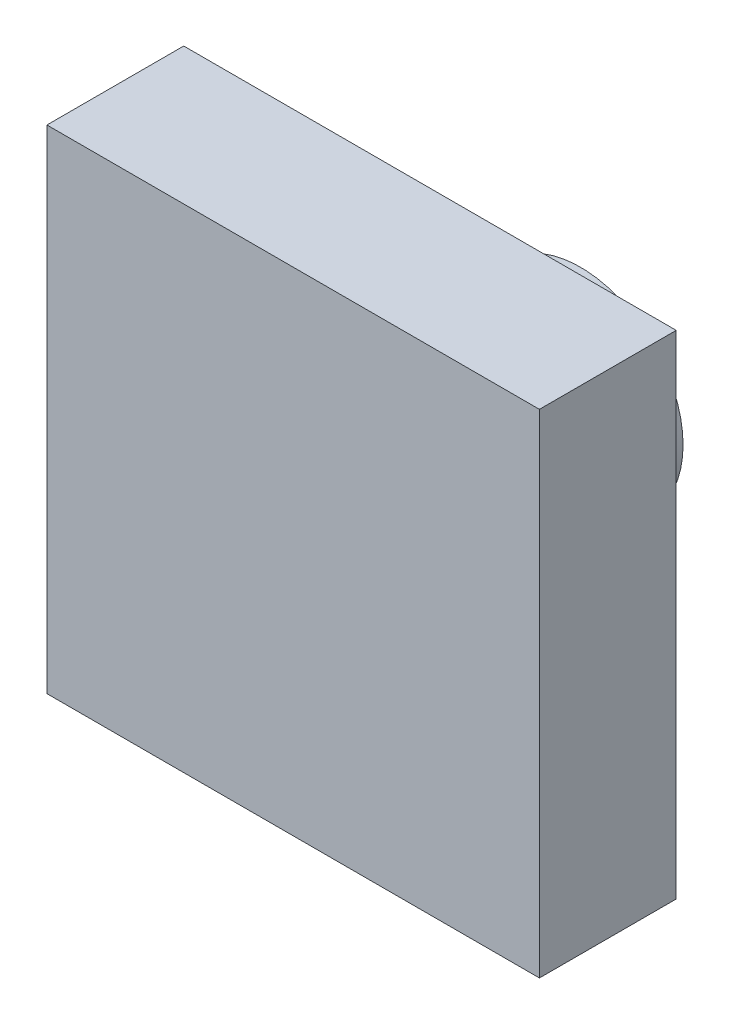
ISO-10303-21;
HEADER;
FILE_DESCRIPTION(('STEP AP214'),'2;1');
FILE_NAME('part.step','',(''),(''),'','','');
FILE_SCHEMA(('AUTOMOTIVE_DESIGN { 1 0 10303 214 1 1 1 1 }'));
ENDSEC;
DATA;
#1=APPLICATION_CONTEXT('core data for automotive mechanical design processes');
#2=APPLICATION_PROTOCOL_DEFINITION('international standard','automotive_design',2000,#1);
#3=PRODUCT_CONTEXT('',#1,'mechanical');
#4=PRODUCT('Part','Part','',(#3));
#5=PRODUCT_RELATED_PRODUCT_CATEGORY('part','',(#4));
#6=PRODUCT_DEFINITION_FORMATION('','',#4);
#7=PRODUCT_DEFINITION_CONTEXT('part definition',#1,'design');
#8=PRODUCT_DEFINITION('design','',#6,#7);
#9=PRODUCT_DEFINITION_SHAPE('','',#8);
#10=(LENGTH_UNIT() NAMED_UNIT(*) SI_UNIT(.MILLI.,.METRE.));
#11=(NAMED_UNIT(*) PLANE_ANGLE_UNIT() SI_UNIT($,.RADIAN.));
#12=(NAMED_UNIT(*) SI_UNIT($,.STERADIAN.) SOLID_ANGLE_UNIT());
#13=UNCERTAINTY_MEASURE_WITH_UNIT(LENGTH_MEASURE(1.E-05),#10,'distance_accuracy_value','');
#14=(GEOMETRIC_REPRESENTATION_CONTEXT(3) GLOBAL_UNCERTAINTY_ASSIGNED_CONTEXT((#13)) GLOBAL_UNIT_ASSIGNED_CONTEXT((#10,
#11,#12)) REPRESENTATION_CONTEXT('',''));
#15=CARTESIAN_POINT('',(0.,0.,0.));
#16=DIRECTION('',(0.,0.,1.));
#17=DIRECTION('',(1.,0.,0.));
#18=AXIS2_PLACEMENT_3D('',#15,#16,#17);
#19=CARTESIAN_POINT('',(0.,0.,0.));
#20=DIRECTION('',(0.,0.,1.));
#21=DIRECTION('',(1.,0.,0.));
#22=AXIS2_PLACEMENT_3D('',#19,#20,#21);
#23=PLANE('',#22);
#24=DIRECTION('',(0.,1.,0.));
#25=VECTOR('',#24,1.);
#26=CARTESIAN_POINT('',(-18.,0.,0.));
#27=LINE('',#26,#25);
#28=CARTESIAN_POINT('',(-18.,-18.,0.));
#29=VERTEX_POINT('',#28);
#30=CARTESIAN_POINT('',(-18.,18.,0.));
#31=VERTEX_POINT('',#30);
#32=EDGE_CURVE('E152',#29,#31,#27,.T.);
#33=ORIENTED_EDGE('',*,*,#32,.T.);
#34=DIRECTION('',(-1.,0.,0.));
#35=VECTOR('',#34,1.);
#36=CARTESIAN_POINT('',(0.,18.,0.));
#37=LINE('',#36,#35);
#38=CARTESIAN_POINT('',(18.,18.,0.));
#39=VERTEX_POINT('',#38);
#40=EDGE_CURVE('E159',#39,#31,#37,.T.);
#41=ORIENTED_EDGE('',*,*,#40,.F.);
#42=DIRECTION('',(0.,1.,0.));
#43=VECTOR('',#42,1.);
#44=CARTESIAN_POINT('',(18.,0.,0.));
#45=LINE('',#44,#43);
#46=CARTESIAN_POINT('',(18.,-18.,0.));
#47=VERTEX_POINT('',#46);
#48=EDGE_CURVE('E170',#47,#39,#45,.T.);
#49=ORIENTED_EDGE('',*,*,#48,.F.);
#50=DIRECTION('',(-1.,0.,0.));
#51=VECTOR('',#50,1.);
#52=CARTESIAN_POINT('',(0.,-18.,0.));
#53=LINE('',#52,#51);
#54=EDGE_CURVE('E167',#47,#29,#53,.T.);
#55=ORIENTED_EDGE('',*,*,#54,.T.);
#56=EDGE_LOOP('',(#33,#41,#49,#55));
#57=FACE_BOUND('',#56,.T.);
#58=DIRECTION('',(0.,1.,0.));
#59=VECTOR('',#58,1.);
#60=CARTESIAN_POINT('',(-10.8100558659218,0.,0.));
#61=LINE('',#60,#59);
#62=CARTESIAN_POINT('',(-10.8100558659218,-10.8100558659218,0.));
#63=VERTEX_POINT('',#62);
#64=CARTESIAN_POINT('',(-10.8100558659218,10.8100558659218,0.));
#65=VERTEX_POINT('',#64);
#66=EDGE_CURVE('E59',#63,#65,#61,.T.);
#67=ORIENTED_EDGE('',*,*,#66,.F.);
#68=DIRECTION('',(-1.,0.,0.));
#69=VECTOR('',#68,1.);
#70=CARTESIAN_POINT('',(0.,-10.8100558659218,0.));
#71=LINE('',#70,#69);
#72=CARTESIAN_POINT('',(10.8100558659218,-10.8100558659218,0.));
#73=VERTEX_POINT('',#72);
#74=EDGE_CURVE('E130',#73,#63,#71,.T.);
#75=ORIENTED_EDGE('',*,*,#74,.F.);
#76=DIRECTION('',(0.,1.,0.));
#77=VECTOR('',#76,1.);
#78=CARTESIAN_POINT('',(10.8100558659218,0.,0.));
#79=LINE('',#78,#77);
#80=CARTESIAN_POINT('',(10.8100558659218,10.8100558659218,0.));
#81=VERTEX_POINT('',#80);
#82=EDGE_CURVE('E140',#73,#81,#79,.T.);
#83=ORIENTED_EDGE('',*,*,#82,.T.);
#84=DIRECTION('',(-1.,0.,0.));
#85=VECTOR('',#84,1.);
#86=CARTESIAN_POINT('',(0.,10.8100558659218,0.));
#87=LINE('',#86,#85);
#88=EDGE_CURVE('E137',#81,#65,#87,.T.);
#89=ORIENTED_EDGE('',*,*,#88,.T.);
#90=EDGE_LOOP('',(#67,#75,#83,#89));
#91=FACE_BOUND('',#90,.T.);
#92=ADVANCED_FACE('F43',(#57,#91),#23,.F.);
#93=CARTESIAN_POINT('',(-18.,0.,10.));
#94=DIRECTION('',(-1.,0.,0.));
#95=DIRECTION('',(0.,0.,1.));
#96=AXIS2_PLACEMENT_3D('',#93,#94,#95);
#97=PLANE('',#96);
#98=ORIENTED_EDGE('',*,*,#32,.F.);
#99=DIRECTION('',(0.,0.,-1.));
#100=VECTOR('',#99,1.);
#101=CARTESIAN_POINT('',(-18.,-18.,10.));
#102=LINE('',#101,#100);
#103=CARTESIAN_POINT('',(-18.,-18.,10.));
#104=VERTEX_POINT('',#103);
#105=EDGE_CURVE('E47',#104,#29,#102,.T.);
#106=ORIENTED_EDGE('',*,*,#105,.F.);
#107=DIRECTION('',(0.,1.,0.));
#108=VECTOR('',#107,1.);
#109=CARTESIAN_POINT('',(-18.,0.,10.));
#110=LINE('',#109,#108);
#111=CARTESIAN_POINT('',(-18.,18.,10.));
#112=VERTEX_POINT('',#111);
#113=EDGE_CURVE('E156',#104,#112,#110,.T.);
#114=ORIENTED_EDGE('',*,*,#113,.T.);
#115=DIRECTION('',(0.,0.,-1.));
#116=VECTOR('',#115,1.);
#117=CARTESIAN_POINT('',(-18.,18.,10.));
#118=LINE('',#117,#116);
#119=EDGE_CURVE('E89',#112,#31,#118,.T.);
#120=ORIENTED_EDGE('',*,*,#119,.T.);
#121=EDGE_LOOP('',(#98,#106,#114,#120));
#122=FACE_BOUND('',#121,.T.);
#123=ADVANCED_FACE('F45',(#122),#97,.T.);
#124=CARTESIAN_POINT('',(0.,-18.,10.));
#125=DIRECTION('',(0.,-1.,0.));
#126=DIRECTION('',(1.,0.,0.));
#127=AXIS2_PLACEMENT_3D('',#124,#125,#126);
#128=PLANE('',#127);
#129=ORIENTED_EDGE('',*,*,#54,.F.);
#130=DIRECTION('',(0.,0.,-1.));
#131=VECTOR('',#130,1.);
#132=CARTESIAN_POINT('',(18.,-18.,10.));
#133=LINE('',#132,#131);
#134=CARTESIAN_POINT('',(18.,-18.,10.));
#135=VERTEX_POINT('',#134);
#136=EDGE_CURVE('E176',#135,#47,#133,.T.);
#137=ORIENTED_EDGE('',*,*,#136,.F.);
#138=DIRECTION('',(-1.,0.,0.));
#139=VECTOR('',#138,1.);
#140=CARTESIAN_POINT('',(0.,-18.,10.));
#141=LINE('',#140,#139);
#142=EDGE_CURVE('E158',#135,#104,#141,.T.);
#143=ORIENTED_EDGE('',*,*,#142,.T.);
#144=ORIENTED_EDGE('',*,*,#105,.T.);
#145=EDGE_LOOP('',(#129,#137,#143,#144));
#146=FACE_BOUND('',#145,.T.);
#147=ADVANCED_FACE('F182',(#146),#128,.T.);
#148=CARTESIAN_POINT('',(18.,0.,10.));
#149=DIRECTION('',(-1.,0.,0.));
#150=DIRECTION('',(0.,0.,1.));
#151=AXIS2_PLACEMENT_3D('',#148,#149,#150);
#152=PLANE('',#151);
#153=ORIENTED_EDGE('',*,*,#48,.T.);
#154=DIRECTION('',(0.,0.,-1.));
#155=VECTOR('',#154,1.);
#156=CARTESIAN_POINT('',(18.,18.,10.));
#157=LINE('',#156,#155);
#158=CARTESIAN_POINT('',(18.,18.,10.));
#159=VERTEX_POINT('',#158);
#160=EDGE_CURVE('E174',#159,#39,#157,.T.);
#161=ORIENTED_EDGE('',*,*,#160,.F.);
#162=DIRECTION('',(0.,1.,0.));
#163=VECTOR('',#162,1.);
#164=CARTESIAN_POINT('',(18.,0.,10.));
#165=LINE('',#164,#163);
#166=EDGE_CURVE('E162',#135,#159,#165,.T.);
#167=ORIENTED_EDGE('',*,*,#166,.F.);
#168=ORIENTED_EDGE('',*,*,#136,.T.);
#169=EDGE_LOOP('',(#153,#161,#167,#168));
#170=FACE_BOUND('',#169,.T.);
#171=ADVANCED_FACE('F188',(#170),#152,.F.);
#172=CARTESIAN_POINT('',(0.,18.,10.));
#173=DIRECTION('',(0.,-1.,0.));
#174=DIRECTION('',(1.,0.,0.));
#175=AXIS2_PLACEMENT_3D('',#172,#173,#174);
#176=PLANE('',#175);
#177=ORIENTED_EDGE('',*,*,#40,.T.);
#178=ORIENTED_EDGE('',*,*,#119,.F.);
#179=DIRECTION('',(-1.,0.,0.));
#180=VECTOR('',#179,1.);
#181=CARTESIAN_POINT('',(0.,18.,10.));
#182=LINE('',#181,#180);
#183=EDGE_CURVE('E68',#159,#112,#182,.T.);
#184=ORIENTED_EDGE('',*,*,#183,.F.);
#185=ORIENTED_EDGE('',*,*,#160,.T.);
#186=EDGE_LOOP('',(#177,#178,#184,#185));
#187=FACE_BOUND('',#186,.T.);
#188=ADVANCED_FACE('F190',(#187),#176,.F.);
#189=CARTESIAN_POINT('',(0.,0.,10.));
#190=DIRECTION('',(0.,0.,1.));
#191=DIRECTION('',(1.,0.,0.));
#192=AXIS2_PLACEMENT_3D('',#189,#190,#191);
#193=PLANE('',#192);
#194=ORIENTED_EDGE('',*,*,#113,.F.);
#195=ORIENTED_EDGE('',*,*,#142,.F.);
#196=ORIENTED_EDGE('',*,*,#166,.T.);
#197=ORIENTED_EDGE('',*,*,#183,.T.);
#198=EDGE_LOOP('',(#194,#195,#196,#197));
#199=FACE_BOUND('',#198,.T.);
#200=ADVANCED_FACE('F191',(#199),#193,.T.);
#201=CARTESIAN_POINT('',(-10.8100558659218,0.,-3.));
#202=DIRECTION('',(1.,0.,0.));
#203=DIRECTION('',(0.,0.,-1.));
#204=AXIS2_PLACEMENT_3D('',#201,#202,#203);
#205=PLANE('',#204);
#206=ORIENTED_EDGE('',*,*,#66,.T.);
#207=DIRECTION('',(0.,0.,1.));
#208=VECTOR('',#207,1.);
#209=CARTESIAN_POINT('',(-10.8100558659218,10.8100558659218,-3.));
#210=LINE('',#209,#208);
#211=CARTESIAN_POINT('',(-10.8100558659218,10.8100558659218,-3.));
#212=VERTEX_POINT('',#211);
#213=EDGE_CURVE('E135',#212,#65,#210,.T.);
#214=ORIENTED_EDGE('',*,*,#213,.F.);
#215=DIRECTION('',(0.,1.,0.));
#216=VECTOR('',#215,1.);
#217=CARTESIAN_POINT('',(-10.8100558659218,0.,-3.));
#218=LINE('',#217,#216);
#219=CARTESIAN_POINT('',(-10.8100558659218,-10.8100558659218,-3.));
#220=VERTEX_POINT('',#219);
#221=EDGE_CURVE('E122',#220,#212,#218,.T.);
#222=ORIENTED_EDGE('',*,*,#221,.F.);
#223=DIRECTION('',(0.,0.,1.));
#224=VECTOR('',#223,1.);
#225=CARTESIAN_POINT('',(-10.8100558659218,-10.8100558659218,-3.));
#226=LINE('',#225,#224);
#227=EDGE_CURVE('E127',#220,#63,#226,.T.);
#228=ORIENTED_EDGE('',*,*,#227,.T.);
#229=EDGE_LOOP('',(#206,#214,#222,#228));
#230=FACE_BOUND('',#229,.T.);
#231=ADVANCED_FACE('F134',(#230),#205,.F.);
#232=CARTESIAN_POINT('',(0.,10.8100558659218,-3.));
#233=DIRECTION('',(0.,1.,0.));
#234=DIRECTION('',(0.,0.,1.));
#235=AXIS2_PLACEMENT_3D('',#232,#233,#234);
#236=PLANE('',#235);
#237=ORIENTED_EDGE('',*,*,#88,.F.);
#238=DIRECTION('',(0.,0.,1.));
#239=VECTOR('',#238,1.);
#240=CARTESIAN_POINT('',(10.8100558659218,10.8100558659218,-3.));
#241=LINE('',#240,#239);
#242=CARTESIAN_POINT('',(10.8100558659218,10.8100558659218,-3.));
#243=VERTEX_POINT('',#242);
#244=EDGE_CURVE('E153',#243,#81,#241,.T.);
#245=ORIENTED_EDGE('',*,*,#244,.F.);
#246=DIRECTION('',(-1.,0.,0.));
#247=VECTOR('',#246,1.);
#248=CARTESIAN_POINT('',(0.,10.8100558659218,-3.));
#249=LINE('',#248,#247);
#250=EDGE_CURVE('E132',#243,#212,#249,.T.);
#251=ORIENTED_EDGE('',*,*,#250,.T.);
#252=ORIENTED_EDGE('',*,*,#213,.T.);
#253=EDGE_LOOP('',(#237,#245,#251,#252));
#254=FACE_BOUND('',#253,.T.);
#255=ADVANCED_FACE('F198',(#254),#236,.T.);
#256=CARTESIAN_POINT('',(10.8100558659218,0.,-3.));
#257=DIRECTION('',(1.,0.,0.));
#258=DIRECTION('',(0.,0.,-1.));
#259=AXIS2_PLACEMENT_3D('',#256,#257,#258);
#260=PLANE('',#259);
#261=ORIENTED_EDGE('',*,*,#82,.F.);
#262=DIRECTION('',(0.,0.,1.));
#263=VECTOR('',#262,1.);
#264=CARTESIAN_POINT('',(10.8100558659218,-10.8100558659218,-3.));
#265=LINE('',#264,#263);
#266=CARTESIAN_POINT('',(10.8100558659218,-10.8100558659218,-3.));
#267=VERTEX_POINT('',#266);
#268=EDGE_CURVE('E131',#267,#73,#265,.T.);
#269=ORIENTED_EDGE('',*,*,#268,.F.);
#270=DIRECTION('',(0.,1.,0.));
#271=VECTOR('',#270,1.);
#272=CARTESIAN_POINT('',(10.8100558659218,0.,-3.));
#273=LINE('',#272,#271);
#274=EDGE_CURVE('E124',#267,#243,#273,.T.);
#275=ORIENTED_EDGE('',*,*,#274,.T.);
#276=ORIENTED_EDGE('',*,*,#244,.T.);
#277=EDGE_LOOP('',(#261,#269,#275,#276));
#278=FACE_BOUND('',#277,.T.);
#279=ADVANCED_FACE('F247',(#278),#260,.T.);
#280=CARTESIAN_POINT('',(0.,-10.8100558659218,-3.));
#281=DIRECTION('',(0.,1.,0.));
#282=DIRECTION('',(0.,0.,1.));
#283=AXIS2_PLACEMENT_3D('',#280,#281,#282);
#284=PLANE('',#283);
#285=ORIENTED_EDGE('',*,*,#74,.T.);
#286=ORIENTED_EDGE('',*,*,#227,.F.);
#287=DIRECTION('',(-1.,0.,0.));
#288=VECTOR('',#287,1.);
#289=CARTESIAN_POINT('',(0.,-10.8100558659218,-3.));
#290=LINE('',#289,#288);
#291=EDGE_CURVE('E117',#267,#220,#290,.T.);
#292=ORIENTED_EDGE('',*,*,#291,.F.);
#293=ORIENTED_EDGE('',*,*,#268,.T.);
#294=EDGE_LOOP('',(#285,#286,#292,#293));
#295=FACE_BOUND('',#294,.T.);
#296=ADVANCED_FACE('F128',(#295),#284,.F.);
#297=CARTESIAN_POINT('',(0.,0.,-3.));
#298=DIRECTION('',(0.,0.,1.));
#299=DIRECTION('',(1.,0.,0.));
#300=AXIS2_PLACEMENT_3D('',#297,#298,#299);
#301=PLANE('',#300);
#302=CARTESIAN_POINT('',(0.,0.,-3.));
#303=DIRECTION('',(0.,0.,-1.));
#304=DIRECTION('',(-1.,0.,0.));
#305=AXIS2_PLACEMENT_3D('',#302,#303,#304);
#306=CIRCLE('',#305,7.5);
#307=CARTESIAN_POINT('',(-7.5,0.,-3.));
#308=VERTEX_POINT('',#307);
#309=EDGE_CURVE('E11',#308,#308,#306,.T.);
#310=ORIENTED_EDGE('',*,*,#309,.F.);
#311=EDGE_LOOP('',(#310));
#312=FACE_BOUND('',#311,.T.);
#313=ORIENTED_EDGE('',*,*,#221,.T.);
#314=ORIENTED_EDGE('',*,*,#250,.F.);
#315=ORIENTED_EDGE('',*,*,#274,.F.);
#316=ORIENTED_EDGE('',*,*,#291,.T.);
#317=EDGE_LOOP('',(#313,#314,#315,#316));
#318=FACE_BOUND('',#317,.T.);
#319=ADVANCED_FACE('F119',(#312,#318),#301,.F.);
#320=CARTESIAN_POINT('',(0.,0.,-11.));
#321=DIRECTION('',(0.,0.,1.));
#322=DIRECTION('',(1.,0.,0.));
#323=AXIS2_PLACEMENT_3D('',#320,#321,#322);
#324=CYLINDRICAL_SURFACE('',#323,7.5);
#325=CARTESIAN_POINT('',(0.,0.,-11.));
#326=DIRECTION('',(0.,0.,-1.));
#327=DIRECTION('',(-1.,0.,0.));
#328=AXIS2_PLACEMENT_3D('',#325,#326,#327);
#329=CIRCLE('',#328,7.5);
#330=CARTESIAN_POINT('',(-7.5,0.,-11.));
#331=VERTEX_POINT('',#330);
#332=EDGE_CURVE('E147',#331,#331,#329,.T.);
#333=ORIENTED_EDGE('',*,*,#332,.F.);
#334=EDGE_LOOP('',(#333));
#335=FACE_BOUND('',#334,.T.);
#336=ORIENTED_EDGE('',*,*,#309,.T.);
#337=EDGE_LOOP('',(#336));
#338=FACE_BOUND('',#337,.T.);
#339=ADVANCED_FACE('F277',(#335,#338),#324,.T.);
#340=CARTESIAN_POINT('',(0.,0.,-11.));
#341=DIRECTION('',(0.,0.,-1.));
#342=DIRECTION('',(-1.,0.,0.));
#343=AXIS2_PLACEMENT_3D('',#340,#341,#342);
#344=PLANE('',#343);
#345=ORIENTED_EDGE('',*,*,#332,.T.);
#346=EDGE_LOOP('',(#345));
#347=FACE_BOUND('',#346,.T.);
#348=ADVANCED_FACE('F288',(#347),#344,.T.);
#349=CLOSED_SHELL('',(#92,#123,#147,#171,#188,#200,#231,#255,#279,#296,#319,#339,#348));
#350=MANIFOLD_SOLID_BREP('B2',#349);
#351=ADVANCED_BREP_SHAPE_REPRESENTATION('',(#18,#350),#14);
#352=SHAPE_DEFINITION_REPRESENTATION(#9,#351);
ENDSEC;
END-ISO-10303-21;
